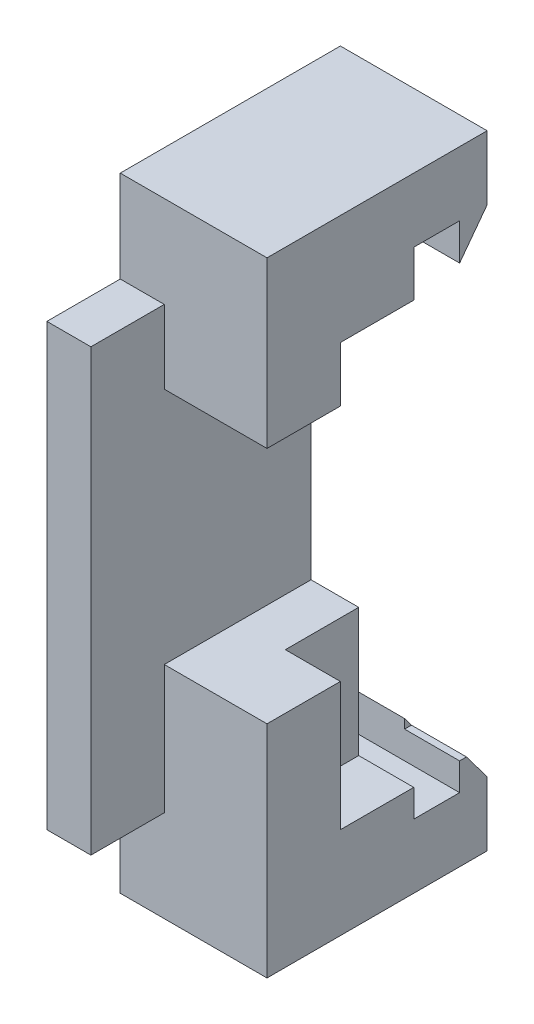
ISO-10303-21;
HEADER;
FILE_DESCRIPTION(('STEP AP214'),'2;1');
FILE_NAME('part.step','',(''),(''),'','','');
FILE_SCHEMA(('AUTOMOTIVE_DESIGN { 1 0 10303 214 1 1 1 1 }'));
ENDSEC;
DATA;
#1=APPLICATION_CONTEXT('core data for automotive mechanical design processes');
#2=APPLICATION_PROTOCOL_DEFINITION('international standard','automotive_design',2000,#1);
#3=PRODUCT_CONTEXT('',#1,'mechanical');
#4=PRODUCT('Part','Part','',(#3));
#5=PRODUCT_RELATED_PRODUCT_CATEGORY('part','',(#4));
#6=PRODUCT_DEFINITION_FORMATION('','',#4);
#7=PRODUCT_DEFINITION_CONTEXT('part definition',#1,'design');
#8=PRODUCT_DEFINITION('design','',#6,#7);
#9=PRODUCT_DEFINITION_SHAPE('','',#8);
#10=(LENGTH_UNIT() NAMED_UNIT(*) SI_UNIT(.MILLI.,.METRE.));
#11=(NAMED_UNIT(*) PLANE_ANGLE_UNIT() SI_UNIT($,.RADIAN.));
#12=(NAMED_UNIT(*) SI_UNIT($,.STERADIAN.) SOLID_ANGLE_UNIT());
#13=UNCERTAINTY_MEASURE_WITH_UNIT(LENGTH_MEASURE(1.E-05),#10,'distance_accuracy_value','');
#14=(GEOMETRIC_REPRESENTATION_CONTEXT(3) GLOBAL_UNCERTAINTY_ASSIGNED_CONTEXT((#13)) GLOBAL_UNIT_ASSIGNED_CONTEXT((#10,
#11,#12)) REPRESENTATION_CONTEXT('',''));
#15=CARTESIAN_POINT('',(0.,0.,0.));
#16=DIRECTION('',(0.,0.,1.));
#17=DIRECTION('',(1.,0.,0.));
#18=AXIS2_PLACEMENT_3D('',#15,#16,#17);
#19=CARTESIAN_POINT('',(4.,0.,6.));
#20=DIRECTION('',(-1.,0.,0.));
#21=DIRECTION('',(0.,0.,1.));
#22=AXIS2_PLACEMENT_3D('',#19,#20,#21);
#23=PLANE('',#22);
#24=DIRECTION('',(0.,1.,0.));
#25=VECTOR('',#24,1.);
#26=CARTESIAN_POINT('',(4.,5.25,4.));
#27=LINE('',#26,#25);
#28=CARTESIAN_POINT('',(4.,2.5,4.));
#29=VERTEX_POINT('',#28);
#30=CARTESIAN_POINT('',(4.,6.,4.));
#31=VERTEX_POINT('',#30);
#32=EDGE_CURVE('E368',#29,#31,#27,.T.);
#33=ORIENTED_EDGE('',*,*,#32,.T.);
#34=DIRECTION('',(0.,0.,1.));
#35=VECTOR('',#34,1.);
#36=CARTESIAN_POINT('',(4.,6.,0.));
#37=LINE('',#36,#35);
#38=CARTESIAN_POINT('',(4.,6.,6.));
#39=VERTEX_POINT('',#38);
#40=EDGE_CURVE('E327',#31,#39,#37,.T.);
#41=ORIENTED_EDGE('',*,*,#40,.T.);
#42=DIRECTION('',(0.,1.,0.));
#43=VECTOR('',#42,1.);
#44=CARTESIAN_POINT('',(4.,0.,6.));
#45=LINE('',#44,#43);
#46=CARTESIAN_POINT('',(4.,0.,6.));
#47=VERTEX_POINT('',#46);
#48=EDGE_CURVE('E270',#47,#39,#45,.T.);
#49=ORIENTED_EDGE('',*,*,#48,.F.);
#50=DIRECTION('',(0.,0.,-1.));
#51=VECTOR('',#50,1.);
#52=CARTESIAN_POINT('',(4.,0.,6.));
#53=LINE('',#52,#51);
#54=CARTESIAN_POINT('',(4.,0.,0.));
#55=VERTEX_POINT('',#54);
#56=EDGE_CURVE('E293',#47,#55,#53,.T.);
#57=ORIENTED_EDGE('',*,*,#56,.T.);
#58=DIRECTION('',(0.,1.,0.));
#59=VECTOR('',#58,1.);
#60=CARTESIAN_POINT('',(4.,0.,0.));
#61=LINE('',#60,#59);
#62=CARTESIAN_POINT('',(4.,1.75,0.));
#63=VERTEX_POINT('',#62);
#64=EDGE_CURVE('E283',#55,#63,#61,.T.);
#65=ORIENTED_EDGE('',*,*,#64,.T.);
#66=DIRECTION('',(0.,0.799999999999999,0.600000000000001));
#67=VECTOR('',#66,1.);
#68=CARTESIAN_POINT('',(4.,1.75,0.));
#69=LINE('',#68,#67);
#70=CARTESIAN_POINT('',(4.,2.5,0.562500000000002));
#71=VERTEX_POINT('',#70);
#72=EDGE_CURVE('E375',#63,#71,#69,.T.);
#73=ORIENTED_EDGE('',*,*,#72,.T.);
#74=DIRECTION('',(0.,0.,1.));
#75=VECTOR('',#74,1.);
#76=CARTESIAN_POINT('',(4.,2.5,0.));
#77=LINE('',#76,#75);
#78=CARTESIAN_POINT('',(4.,2.5,0.750000000000002));
#79=VERTEX_POINT('',#78);
#80=EDGE_CURVE('E259',#71,#79,#77,.T.);
#81=ORIENTED_EDGE('',*,*,#80,.T.);
#82=DIRECTION('',(0.,-1.,0.));
#83=VECTOR('',#82,1.);
#84=CARTESIAN_POINT('',(4.,2.75,0.750000000000002));
#85=LINE('',#84,#83);
#86=CARTESIAN_POINT('',(4.,1.75,0.750000000000002));
#87=VERTEX_POINT('',#86);
#88=EDGE_CURVE('E377',#79,#87,#85,.T.);
#89=ORIENTED_EDGE('',*,*,#88,.T.);
#90=DIRECTION('',(0.,0.,1.));
#91=VECTOR('',#90,1.);
#92=CARTESIAN_POINT('',(4.,1.75,0.750000000000002));
#93=LINE('',#92,#91);
#94=CARTESIAN_POINT('',(4.,1.75,2.));
#95=VERTEX_POINT('',#94);
#96=EDGE_CURVE('E381',#87,#95,#93,.T.);
#97=ORIENTED_EDGE('',*,*,#96,.T.);
#98=DIRECTION('',(0.,1.,0.));
#99=VECTOR('',#98,1.);
#100=CARTESIAN_POINT('',(4.,15.25,2.));
#101=LINE('',#100,#99);
#102=CARTESIAN_POINT('',(4.,2.5,2.));
#103=VERTEX_POINT('',#102);
#104=EDGE_CURVE('E385',#95,#103,#101,.T.);
#105=ORIENTED_EDGE('',*,*,#104,.T.);
#106=EDGE_CURVE('E256',#103,#29,#77,.T.);
#107=ORIENTED_EDGE('',*,*,#106,.T.);
#108=EDGE_LOOP('',(#33,#41,#49,#57,#65,#73,#81,#89,#97,#105,#107));
#109=FACE_BOUND('',#108,.T.);
#110=ADVANCED_FACE('F33',(#109),#23,.F.);
#111=CARTESIAN_POINT('',(0.,0.,6.));
#112=DIRECTION('',(0.,0.,-1.));
#113=DIRECTION('',(-1.,0.,0.));
#114=AXIS2_PLACEMENT_3D('',#111,#112,#113);
#115=PLANE('',#114);
#116=DIRECTION('',(-1.,0.,0.));
#117=VECTOR('',#116,1.);
#118=CARTESIAN_POINT('',(0.,14.5,6.));
#119=LINE('',#118,#117);
#120=CARTESIAN_POINT('',(1.2,14.5,6.));
#121=VERTEX_POINT('',#120);
#122=CARTESIAN_POINT('',(0.,14.5,6.));
#123=VERTEX_POINT('',#122);
#124=EDGE_CURVE('E58',#121,#123,#119,.T.);
#125=ORIENTED_EDGE('',*,*,#124,.F.);
#126=DIRECTION('',(0.,1.,0.));
#127=VECTOR('',#126,1.);
#128=CARTESIAN_POINT('',(1.2,14.5,6.));
#129=LINE('',#128,#127);
#130=CARTESIAN_POINT('',(1.2,12.5,6.));
#131=VERTEX_POINT('',#130);
#132=EDGE_CURVE('E11',#131,#121,#129,.T.);
#133=ORIENTED_EDGE('',*,*,#132,.F.);
#134=DIRECTION('',(-1.,0.,0.));
#135=VECTOR('',#134,1.);
#136=CARTESIAN_POINT('',(4.,12.5,6.));
#137=LINE('',#136,#135);
#138=CARTESIAN_POINT('',(4.,12.5,6.));
#139=VERTEX_POINT('',#138);
#140=EDGE_CURVE('E252',#139,#131,#137,.T.);
#141=ORIENTED_EDGE('',*,*,#140,.F.);
#142=CARTESIAN_POINT('',(4.,17.,6.));
#143=VERTEX_POINT('',#142);
#144=EDGE_CURVE('E244',#139,#143,#45,.T.);
#145=ORIENTED_EDGE('',*,*,#144,.T.);
#146=DIRECTION('',(-1.,0.,0.));
#147=VECTOR('',#146,1.);
#148=CARTESIAN_POINT('',(0.,17.,6.));
#149=LINE('',#148,#147);
#150=CARTESIAN_POINT('',(0.,17.,6.));
#151=VERTEX_POINT('',#150);
#152=EDGE_CURVE('E273',#143,#151,#149,.T.);
#153=ORIENTED_EDGE('',*,*,#152,.T.);
#154=DIRECTION('',(0.,-1.,0.));
#155=VECTOR('',#154,1.);
#156=CARTESIAN_POINT('',(0.,0.,6.));
#157=LINE('',#156,#155);
#158=EDGE_CURVE('E265',#151,#123,#157,.T.);
#159=ORIENTED_EDGE('',*,*,#158,.T.);
#160=EDGE_LOOP('',(#125,#133,#141,#145,#153,#159));
#161=FACE_BOUND('',#160,.T.);
#162=ADVANCED_FACE('F447',(#161),#115,.F.);
#163=CARTESIAN_POINT('',(1.2,2.5,6.));
#164=VERTEX_POINT('',#163);
#165=CARTESIAN_POINT('',(1.2,6.,6.));
#166=VERTEX_POINT('',#165);
#167=EDGE_CURVE('E43',#164,#166,#129,.T.);
#168=ORIENTED_EDGE('',*,*,#167,.F.);
#169=DIRECTION('',(1.,0.,0.));
#170=VECTOR('',#169,1.);
#171=CARTESIAN_POINT('',(0.,2.5,6.));
#172=LINE('',#171,#170);
#173=CARTESIAN_POINT('',(0.,2.5,6.));
#174=VERTEX_POINT('',#173);
#175=EDGE_CURVE('E350',#174,#164,#172,.T.);
#176=ORIENTED_EDGE('',*,*,#175,.F.);
#177=CARTESIAN_POINT('',(0.,0.,6.));
#178=VERTEX_POINT('',#177);
#179=EDGE_CURVE('E268',#174,#178,#157,.T.);
#180=ORIENTED_EDGE('',*,*,#179,.T.);
#181=DIRECTION('',(1.,0.,0.));
#182=VECTOR('',#181,1.);
#183=CARTESIAN_POINT('',(0.,0.,6.));
#184=LINE('',#183,#182);
#185=EDGE_CURVE('E267',#178,#47,#184,.T.);
#186=ORIENTED_EDGE('',*,*,#185,.T.);
#187=ORIENTED_EDGE('',*,*,#48,.T.);
#188=DIRECTION('',(1.,0.,0.));
#189=VECTOR('',#188,1.);
#190=CARTESIAN_POINT('',(4.,6.,6.));
#191=LINE('',#190,#189);
#192=EDGE_CURVE('E246',#166,#39,#191,.T.);
#193=ORIENTED_EDGE('',*,*,#192,.F.);
#194=EDGE_LOOP('',(#168,#176,#180,#186,#187,#193));
#195=FACE_BOUND('',#194,.T.);
#196=ADVANCED_FACE('F342',(#195),#115,.F.);
#197=CARTESIAN_POINT('',(0.,0.,0.));
#198=DIRECTION('',(0.,0.,-1.));
#199=DIRECTION('',(-1.,0.,0.));
#200=AXIS2_PLACEMENT_3D('',#197,#198,#199);
#201=PLANE('',#200);
#202=DIRECTION('',(-1.,0.,0.));
#203=VECTOR('',#202,1.);
#204=CARTESIAN_POINT('',(4.,15.25,0.));
#205=LINE('',#204,#203);
#206=CARTESIAN_POINT('',(4.,15.25,0.));
#207=VERTEX_POINT('',#206);
#208=CARTESIAN_POINT('',(0.,15.25,0.));
#209=VERTEX_POINT('',#208);
#210=EDGE_CURVE('E416',#207,#209,#205,.T.);
#211=ORIENTED_EDGE('',*,*,#210,.T.);
#212=DIRECTION('',(0.,-1.,0.));
#213=VECTOR('',#212,1.);
#214=CARTESIAN_POINT('',(0.,0.,0.));
#215=LINE('',#214,#213);
#216=CARTESIAN_POINT('',(0.,17.,0.));
#217=VERTEX_POINT('',#216);
#218=EDGE_CURVE('E276',#217,#209,#215,.T.);
#219=ORIENTED_EDGE('',*,*,#218,.F.);
#220=DIRECTION('',(-1.,0.,0.));
#221=VECTOR('',#220,1.);
#222=CARTESIAN_POINT('',(0.,17.,0.));
#223=LINE('',#222,#221);
#224=CARTESIAN_POINT('',(4.,17.,0.));
#225=VERTEX_POINT('',#224);
#226=EDGE_CURVE('E286',#225,#217,#223,.T.);
#227=ORIENTED_EDGE('',*,*,#226,.F.);
#228=EDGE_CURVE('E282',#207,#225,#61,.T.);
#229=ORIENTED_EDGE('',*,*,#228,.F.);
#230=EDGE_LOOP('',(#211,#219,#227,#229));
#231=FACE_BOUND('',#230,.T.);
#232=ADVANCED_FACE('F490',(#231),#201,.T.);
#233=CARTESIAN_POINT('',(4.,2.5,0.));
#234=DIRECTION('',(0.,-1.,0.));
#235=DIRECTION('',(0.,0.,-1.));
#236=AXIS2_PLACEMENT_3D('',#233,#234,#235);
#237=PLANE('',#236);
#238=DIRECTION('',(0.,0.,1.));
#239=VECTOR('',#238,1.);
#240=CARTESIAN_POINT('',(2.5,2.5,0.));
#241=LINE('',#240,#239);
#242=CARTESIAN_POINT('',(2.5,2.5,2.));
#243=VERTEX_POINT('',#242);
#244=CARTESIAN_POINT('',(2.5,2.5,4.));
#245=VERTEX_POINT('',#244);
#246=EDGE_CURVE('E261',#243,#245,#241,.T.);
#247=ORIENTED_EDGE('',*,*,#246,.T.);
#248=DIRECTION('',(1.,0.,0.));
#249=VECTOR('',#248,1.);
#250=CARTESIAN_POINT('',(2.,2.5,4.));
#251=LINE('',#250,#249);
#252=EDGE_CURVE('E370',#245,#29,#251,.T.);
#253=ORIENTED_EDGE('',*,*,#252,.T.);
#254=ORIENTED_EDGE('',*,*,#106,.F.);
#255=DIRECTION('',(-1.,0.,0.));
#256=VECTOR('',#255,1.);
#257=CARTESIAN_POINT('',(4.,2.5,2.));
#258=LINE('',#257,#256);
#259=EDGE_CURVE('E318',#103,#243,#258,.T.);
#260=ORIENTED_EDGE('',*,*,#259,.T.);
#261=EDGE_LOOP('',(#247,#253,#254,#260));
#262=FACE_BOUND('',#261,.T.);
#263=ADVANCED_FACE('F539',(#262),#237,.F.);
#264=CARTESIAN_POINT('',(2.5,5.25,0.));
#265=DIRECTION('',(-1.,0.,0.));
#266=DIRECTION('',(0.,0.,1.));
#267=AXIS2_PLACEMENT_3D('',#264,#265,#266);
#268=PLANE('',#267);
#269=DIRECTION('',(0.,1.,0.));
#270=VECTOR('',#269,1.);
#271=CARTESIAN_POINT('',(2.5,5.25,2.));
#272=LINE('',#271,#270);
#273=CARTESIAN_POINT('',(2.5,6.,2.));
#274=VERTEX_POINT('',#273);
#275=EDGE_CURVE('E322',#243,#274,#272,.T.);
#276=ORIENTED_EDGE('',*,*,#275,.T.);
#277=DIRECTION('',(0.,0.,-1.));
#278=VECTOR('',#277,1.);
#279=CARTESIAN_POINT('',(2.5,6.,4.));
#280=LINE('',#279,#278);
#281=CARTESIAN_POINT('',(2.5,6.,4.));
#282=VERTEX_POINT('',#281);
#283=EDGE_CURVE('E438',#282,#274,#280,.T.);
#284=ORIENTED_EDGE('',*,*,#283,.F.);
#285=DIRECTION('',(0.,-1.,0.));
#286=VECTOR('',#285,1.);
#287=CARTESIAN_POINT('',(2.5,5.25,4.));
#288=LINE('',#287,#286);
#289=EDGE_CURVE('E372',#282,#245,#288,.T.);
#290=ORIENTED_EDGE('',*,*,#289,.T.);
#291=ORIENTED_EDGE('',*,*,#246,.F.);
#292=EDGE_LOOP('',(#276,#284,#290,#291));
#293=FACE_BOUND('',#292,.T.);
#294=ADVANCED_FACE('F437',(#293),#268,.F.);
#295=CARTESIAN_POINT('',(0.,0.,6.));
#296=DIRECTION('',(1.,0.,0.));
#297=DIRECTION('',(0.,0.,-1.));
#298=AXIS2_PLACEMENT_3D('',#295,#296,#297);
#299=PLANE('',#298);
#300=ORIENTED_EDGE('',*,*,#218,.T.);
#301=DIRECTION('',(0.,0.799999999999999,-0.600000000000001));
#302=VECTOR('',#301,1.);
#303=CARTESIAN_POINT('',(0.,15.25,0.));
#304=LINE('',#303,#302);
#305=CARTESIAN_POINT('',(0.,14.25,0.750000000000002));
#306=VERTEX_POINT('',#305);
#307=EDGE_CURVE('E378',#306,#209,#304,.T.);
#308=ORIENTED_EDGE('',*,*,#307,.F.);
#309=DIRECTION('',(0.,-1.,0.));
#310=VECTOR('',#309,1.);
#311=CARTESIAN_POINT('',(0.,14.25,0.750000000000002));
#312=LINE('',#311,#310);
#313=CARTESIAN_POINT('',(0.,15.25,0.750000000000002));
#314=VERTEX_POINT('',#313);
#315=EDGE_CURVE('E412',#314,#306,#312,.T.);
#316=ORIENTED_EDGE('',*,*,#315,.F.);
#317=DIRECTION('',(0.,0.,-1.));
#318=VECTOR('',#317,1.);
#319=CARTESIAN_POINT('',(0.,15.25,0.750000000000002));
#320=LINE('',#319,#318);
#321=CARTESIAN_POINT('',(0.,15.25,2.));
#322=VERTEX_POINT('',#321);
#323=EDGE_CURVE('E409',#322,#314,#320,.T.);
#324=ORIENTED_EDGE('',*,*,#323,.F.);
#325=DIRECTION('',(0.,1.,0.));
#326=VECTOR('',#325,1.);
#327=CARTESIAN_POINT('',(0.,15.25,2.));
#328=LINE('',#327,#326);
#329=CARTESIAN_POINT('',(0.,1.75,2.));
#330=VERTEX_POINT('',#329);
#331=EDGE_CURVE('E406',#330,#322,#328,.T.);
#332=ORIENTED_EDGE('',*,*,#331,.F.);
#333=DIRECTION('',(0.,0.,1.));
#334=VECTOR('',#333,1.);
#335=CARTESIAN_POINT('',(0.,1.75,0.750000000000002));
#336=LINE('',#335,#334);
#337=CARTESIAN_POINT('',(0.,1.75,0.750000000000002));
#338=VERTEX_POINT('',#337);
#339=EDGE_CURVE('E403',#338,#330,#336,.T.);
#340=ORIENTED_EDGE('',*,*,#339,.F.);
#341=DIRECTION('',(0.,-1.,0.));
#342=VECTOR('',#341,1.);
#343=CARTESIAN_POINT('',(0.,2.75,0.750000000000002));
#344=LINE('',#343,#342);
#345=CARTESIAN_POINT('',(0.,2.75,0.750000000000002));
#346=VERTEX_POINT('',#345);
#347=EDGE_CURVE('E400',#346,#338,#344,.T.);
#348=ORIENTED_EDGE('',*,*,#347,.F.);
#349=DIRECTION('',(0.,0.799999999999999,0.600000000000001));
#350=VECTOR('',#349,1.);
#351=CARTESIAN_POINT('',(0.,1.75,0.));
#352=LINE('',#351,#350);
#353=CARTESIAN_POINT('',(0.,1.75,0.));
#354=VERTEX_POINT('',#353);
#355=EDGE_CURVE('E374',#354,#346,#352,.T.);
#356=ORIENTED_EDGE('',*,*,#355,.F.);
#357=CARTESIAN_POINT('',(0.,0.,0.));
#358=VERTEX_POINT('',#357);
#359=EDGE_CURVE('E280',#354,#358,#215,.T.);
#360=ORIENTED_EDGE('',*,*,#359,.T.);
#361=DIRECTION('',(0.,0.,-1.));
#362=VECTOR('',#361,1.);
#363=CARTESIAN_POINT('',(0.,0.,6.));
#364=LINE('',#363,#362);
#365=EDGE_CURVE('E296',#178,#358,#364,.T.);
#366=ORIENTED_EDGE('',*,*,#365,.F.);
#367=ORIENTED_EDGE('',*,*,#179,.F.);
#368=DIRECTION('',(0.,0.,-1.));
#369=VECTOR('',#368,1.);
#370=CARTESIAN_POINT('',(0.,2.5,8.));
#371=LINE('',#370,#369);
#372=CARTESIAN_POINT('',(0.,2.5,8.));
#373=VERTEX_POINT('',#372);
#374=EDGE_CURVE('E365',#373,#174,#371,.T.);
#375=ORIENTED_EDGE('',*,*,#374,.F.);
#376=DIRECTION('',(0.,-1.,0.));
#377=VECTOR('',#376,1.);
#378=CARTESIAN_POINT('',(0.,14.5,8.));
#379=LINE('',#378,#377);
#380=CARTESIAN_POINT('',(0.,14.5,8.));
#381=VERTEX_POINT('',#380);
#382=EDGE_CURVE('E351',#381,#373,#379,.T.);
#383=ORIENTED_EDGE('',*,*,#382,.F.);
#384=DIRECTION('',(0.,0.,-1.));
#385=VECTOR('',#384,1.);
#386=CARTESIAN_POINT('',(0.,14.5,8.));
#387=LINE('',#386,#385);
#388=EDGE_CURVE('E357',#381,#123,#387,.T.);
#389=ORIENTED_EDGE('',*,*,#388,.T.);
#390=ORIENTED_EDGE('',*,*,#158,.F.);
#391=DIRECTION('',(0.,0.,-1.));
#392=VECTOR('',#391,1.);
#393=CARTESIAN_POINT('',(0.,17.,6.));
#394=LINE('',#393,#392);
#395=EDGE_CURVE('E275',#151,#217,#394,.T.);
#396=ORIENTED_EDGE('',*,*,#395,.T.);
#397=EDGE_LOOP('',(#300,#308,#316,#324,#332,#340,#348,#356,#360,#366,#367,#375,#383,#389,#390,#396));
#398=FACE_BOUND('',#397,.T.);
#399=ADVANCED_FACE('F35',(#398),#299,.F.);
#400=CARTESIAN_POINT('',(0.,0.,6.));
#401=DIRECTION('',(0.,1.,0.));
#402=DIRECTION('',(0.,0.,1.));
#403=AXIS2_PLACEMENT_3D('',#400,#401,#402);
#404=PLANE('',#403);
#405=DIRECTION('',(1.,0.,0.));
#406=VECTOR('',#405,1.);
#407=CARTESIAN_POINT('',(0.,0.,0.));
#408=LINE('',#407,#406);
#409=EDGE_CURVE('E279',#358,#55,#408,.T.);
#410=ORIENTED_EDGE('',*,*,#409,.T.);
#411=ORIENTED_EDGE('',*,*,#56,.F.);
#412=ORIENTED_EDGE('',*,*,#185,.F.);
#413=ORIENTED_EDGE('',*,*,#365,.T.);
#414=EDGE_LOOP('',(#410,#411,#412,#413));
#415=FACE_BOUND('',#414,.T.);
#416=ADVANCED_FACE('F507',(#415),#404,.F.);
#417=DIRECTION('',(0.,-1.,0.));
#418=VECTOR('',#417,1.);
#419=CARTESIAN_POINT('',(4.,12.5,4.));
#420=LINE('',#419,#418);
#421=CARTESIAN_POINT('',(4.,14.,4.));
#422=VERTEX_POINT('',#421);
#423=CARTESIAN_POINT('',(4.,12.5,4.));
#424=VERTEX_POINT('',#423);
#425=EDGE_CURVE('E221',#422,#424,#420,.T.);
#426=ORIENTED_EDGE('',*,*,#425,.F.);
#427=DIRECTION('',(0.,0.,-1.));
#428=VECTOR('',#427,1.);
#429=CARTESIAN_POINT('',(4.,14.,4.));
#430=LINE('',#429,#428);
#431=CARTESIAN_POINT('',(4.,14.,2.));
#432=VERTEX_POINT('',#431);
#433=EDGE_CURVE('E353',#422,#432,#430,.T.);
#434=ORIENTED_EDGE('',*,*,#433,.T.);
#435=CARTESIAN_POINT('',(4.,15.25,2.));
#436=VERTEX_POINT('',#435);
#437=EDGE_CURVE('E384',#432,#436,#101,.T.);
#438=ORIENTED_EDGE('',*,*,#437,.T.);
#439=DIRECTION('',(0.,0.,-1.));
#440=VECTOR('',#439,1.);
#441=CARTESIAN_POINT('',(4.,15.25,0.750000000000002));
#442=LINE('',#441,#440);
#443=CARTESIAN_POINT('',(4.,15.25,0.750000000000002));
#444=VERTEX_POINT('',#443);
#445=EDGE_CURVE('E388',#436,#444,#442,.T.);
#446=ORIENTED_EDGE('',*,*,#445,.T.);
#447=DIRECTION('',(0.,-1.,0.));
#448=VECTOR('',#447,1.);
#449=CARTESIAN_POINT('',(4.,14.25,0.750000000000002));
#450=LINE('',#449,#448);
#451=CARTESIAN_POINT('',(4.,14.25,0.750000000000002));
#452=VERTEX_POINT('',#451);
#453=EDGE_CURVE('E391',#444,#452,#450,.T.);
#454=ORIENTED_EDGE('',*,*,#453,.T.);
#455=DIRECTION('',(0.,0.799999999999999,-0.600000000000001));
#456=VECTOR('',#455,1.);
#457=CARTESIAN_POINT('',(4.,15.25,0.));
#458=LINE('',#457,#456);
#459=EDGE_CURVE('E394',#452,#207,#458,.T.);
#460=ORIENTED_EDGE('',*,*,#459,.T.);
#461=ORIENTED_EDGE('',*,*,#228,.T.);
#462=DIRECTION('',(0.,0.,-1.));
#463=VECTOR('',#462,1.);
#464=CARTESIAN_POINT('',(4.,17.,6.));
#465=LINE('',#464,#463);
#466=EDGE_CURVE('E290',#143,#225,#465,.T.);
#467=ORIENTED_EDGE('',*,*,#466,.F.);
#468=ORIENTED_EDGE('',*,*,#144,.F.);
#469=DIRECTION('',(0.,0.,1.));
#470=VECTOR('',#469,1.);
#471=CARTESIAN_POINT('',(4.,12.5,0.));
#472=LINE('',#471,#470);
#473=EDGE_CURVE('E237',#424,#139,#472,.T.);
#474=ORIENTED_EDGE('',*,*,#473,.F.);
#475=EDGE_LOOP('',(#426,#434,#438,#446,#454,#460,#461,#467,#468,#474));
#476=FACE_BOUND('',#475,.T.);
#477=ADVANCED_FACE('F242',(#476),#23,.F.);
#478=CARTESIAN_POINT('',(0.,17.,6.));
#479=DIRECTION('',(0.,-1.,0.));
#480=DIRECTION('',(0.,0.,-1.));
#481=AXIS2_PLACEMENT_3D('',#478,#479,#480);
#482=PLANE('',#481);
#483=ORIENTED_EDGE('',*,*,#226,.T.);
#484=ORIENTED_EDGE('',*,*,#395,.F.);
#485=ORIENTED_EDGE('',*,*,#152,.F.);
#486=ORIENTED_EDGE('',*,*,#466,.T.);
#487=EDGE_LOOP('',(#483,#484,#485,#486));
#488=FACE_BOUND('',#487,.T.);
#489=ADVANCED_FACE('F497',(#488),#482,.F.);
#490=DIRECTION('',(-1.,0.,0.));
#491=VECTOR('',#490,1.);
#492=CARTESIAN_POINT('',(4.,1.75,0.));
#493=LINE('',#492,#491);
#494=EDGE_CURVE('E397',#63,#354,#493,.T.);
#495=ORIENTED_EDGE('',*,*,#494,.F.);
#496=ORIENTED_EDGE('',*,*,#64,.F.);
#497=ORIENTED_EDGE('',*,*,#409,.F.);
#498=ORIENTED_EDGE('',*,*,#359,.F.);
#499=EDGE_LOOP('',(#495,#496,#497,#498));
#500=FACE_BOUND('',#499,.T.);
#501=ADVANCED_FACE('F499',(#500),#201,.T.);
#502=CARTESIAN_POINT('',(2.5,2.5,0.562500000000002));
#503=VERTEX_POINT('',#502);
#504=CARTESIAN_POINT('',(2.5,2.5,0.750000000000002));
#505=VERTEX_POINT('',#504);
#506=EDGE_CURVE('E260',#503,#505,#241,.T.);
#507=ORIENTED_EDGE('',*,*,#506,.T.);
#508=DIRECTION('',(1.,0.,0.));
#509=VECTOR('',#508,1.);
#510=CARTESIAN_POINT('',(4.,2.5,0.750000000000002));
#511=LINE('',#510,#509);
#512=EDGE_CURVE('E264',#505,#79,#511,.T.);
#513=ORIENTED_EDGE('',*,*,#512,.T.);
#514=ORIENTED_EDGE('',*,*,#80,.F.);
#515=DIRECTION('',(-1.,0.,0.));
#516=VECTOR('',#515,1.);
#517=CARTESIAN_POINT('',(4.,2.5,0.562500000000002));
#518=LINE('',#517,#516);
#519=EDGE_CURVE('E315',#71,#503,#518,.T.);
#520=ORIENTED_EDGE('',*,*,#519,.T.);
#521=EDGE_LOOP('',(#507,#513,#514,#520));
#522=FACE_BOUND('',#521,.T.);
#523=ADVANCED_FACE('F312',(#522),#237,.F.);
#524=DIRECTION('',(0.,0.799999999999999,0.600000000000001));
#525=VECTOR('',#524,1.);
#526=CARTESIAN_POINT('',(2.5,3.98999999999999,1.68));
#527=LINE('',#526,#525);
#528=CARTESIAN_POINT('',(2.5,2.75,0.750000000000002));
#529=VERTEX_POINT('',#528);
#530=EDGE_CURVE('E300',#503,#529,#527,.T.);
#531=ORIENTED_EDGE('',*,*,#530,.T.);
#532=DIRECTION('',(0.,-1.,0.));
#533=VECTOR('',#532,1.);
#534=CARTESIAN_POINT('',(2.5,5.25,0.750000000000002));
#535=LINE('',#534,#533);
#536=EDGE_CURVE('E37',#529,#505,#535,.T.);
#537=ORIENTED_EDGE('',*,*,#536,.T.);
#538=ORIENTED_EDGE('',*,*,#506,.F.);
#539=EDGE_LOOP('',(#531,#537,#538));
#540=FACE_BOUND('',#539,.T.);
#541=ADVANCED_FACE('F306',(#540),#268,.F.);
#542=CARTESIAN_POINT('',(4.,6.,0.));
#543=DIRECTION('',(0.,-1.,0.));
#544=DIRECTION('',(1.,0.,0.));
#545=AXIS2_PLACEMENT_3D('',#542,#543,#544);
#546=PLANE('',#545);
#547=DIRECTION('',(1.,0.,0.));
#548=VECTOR('',#547,1.);
#549=CARTESIAN_POINT('',(2.5,6.,4.));
#550=LINE('',#549,#548);
#551=EDGE_CURVE('E441',#282,#31,#550,.T.);
#552=ORIENTED_EDGE('',*,*,#551,.F.);
#553=ORIENTED_EDGE('',*,*,#283,.T.);
#554=DIRECTION('',(-1.,0.,0.));
#555=VECTOR('',#554,1.);
#556=CARTESIAN_POINT('',(4.,6.,2.));
#557=LINE('',#556,#555);
#558=CARTESIAN_POINT('',(1.2,6.,2.));
#559=VERTEX_POINT('',#558);
#560=EDGE_CURVE('E336',#274,#559,#557,.T.);
#561=ORIENTED_EDGE('',*,*,#560,.T.);
#562=DIRECTION('',(0.,0.,1.));
#563=VECTOR('',#562,1.);
#564=CARTESIAN_POINT('',(1.2,6.,0.));
#565=LINE('',#564,#563);
#566=EDGE_CURVE('E249',#559,#166,#565,.T.);
#567=ORIENTED_EDGE('',*,*,#566,.T.);
#568=ORIENTED_EDGE('',*,*,#192,.T.);
#569=ORIENTED_EDGE('',*,*,#40,.F.);
#570=EDGE_LOOP('',(#552,#553,#561,#567,#568,#569));
#571=FACE_BOUND('',#570,.T.);
#572=ADVANCED_FACE('F332',(#571),#546,.F.);
#573=CARTESIAN_POINT('',(1.2,12.5,0.));
#574=DIRECTION('',(-1.,0.,0.));
#575=DIRECTION('',(0.,-1.,0.));
#576=AXIS2_PLACEMENT_3D('',#573,#574,#575);
#577=PLANE('',#576);
#578=ORIENTED_EDGE('',*,*,#566,.F.);
#579=DIRECTION('',(0.,1.,0.));
#580=VECTOR('',#579,1.);
#581=CARTESIAN_POINT('',(1.2,12.5,2.));
#582=LINE('',#581,#580);
#583=CARTESIAN_POINT('',(1.2,12.5,2.));
#584=VERTEX_POINT('',#583);
#585=EDGE_CURVE('E419',#559,#584,#582,.T.);
#586=ORIENTED_EDGE('',*,*,#585,.T.);
#587=DIRECTION('',(0.,0.,1.));
#588=VECTOR('',#587,1.);
#589=CARTESIAN_POINT('',(1.2,12.5,0.));
#590=LINE('',#589,#588);
#591=EDGE_CURVE('E245',#584,#131,#590,.T.);
#592=ORIENTED_EDGE('',*,*,#591,.T.);
#593=ORIENTED_EDGE('',*,*,#132,.T.);
#594=DIRECTION('',(0.,0.,-1.));
#595=VECTOR('',#594,1.);
#596=CARTESIAN_POINT('',(1.2,14.5,8.));
#597=LINE('',#596,#595);
#598=CARTESIAN_POINT('',(1.2,14.5,8.));
#599=VERTEX_POINT('',#598);
#600=EDGE_CURVE('E360',#599,#121,#597,.T.);
#601=ORIENTED_EDGE('',*,*,#600,.F.);
#602=DIRECTION('',(0.,1.,0.));
#603=VECTOR('',#602,1.);
#604=CARTESIAN_POINT('',(1.2,14.5,8.));
#605=LINE('',#604,#603);
#606=CARTESIAN_POINT('',(1.2,2.5,8.));
#607=VERTEX_POINT('',#606);
#608=EDGE_CURVE('E456',#607,#599,#605,.T.);
#609=ORIENTED_EDGE('',*,*,#608,.F.);
#610=DIRECTION('',(0.,0.,-1.));
#611=VECTOR('',#610,1.);
#612=CARTESIAN_POINT('',(1.2,2.5,8.));
#613=LINE('',#612,#611);
#614=EDGE_CURVE('E349',#607,#164,#613,.T.);
#615=ORIENTED_EDGE('',*,*,#614,.T.);
#616=ORIENTED_EDGE('',*,*,#167,.T.);
#617=EDGE_LOOP('',(#578,#586,#592,#593,#601,#609,#615,#616));
#618=FACE_BOUND('',#617,.T.);
#619=ADVANCED_FACE('F346',(#618),#577,.F.);
#620=CARTESIAN_POINT('',(4.,12.5,0.));
#621=DIRECTION('',(0.,1.,0.));
#622=DIRECTION('',(-1.,0.,0.));
#623=AXIS2_PLACEMENT_3D('',#620,#621,#622);
#624=PLANE('',#623);
#625=DIRECTION('',(1.,0.,0.));
#626=VECTOR('',#625,1.);
#627=CARTESIAN_POINT('',(4.,12.5,2.));
#628=LINE('',#627,#626);
#629=CARTESIAN_POINT('',(2.5,12.5,2.));
#630=VERTEX_POINT('',#629);
#631=EDGE_CURVE('E299',#584,#630,#628,.T.);
#632=ORIENTED_EDGE('',*,*,#631,.T.);
#633=DIRECTION('',(0.,0.,-1.));
#634=VECTOR('',#633,1.);
#635=CARTESIAN_POINT('',(2.5,12.5,4.));
#636=LINE('',#635,#634);
#637=CARTESIAN_POINT('',(2.5,12.5,4.));
#638=VERTEX_POINT('',#637);
#639=EDGE_CURVE('E50',#638,#630,#636,.T.);
#640=ORIENTED_EDGE('',*,*,#639,.F.);
#641=DIRECTION('',(-1.,0.,0.));
#642=VECTOR('',#641,1.);
#643=CARTESIAN_POINT('',(4.,12.5,4.));
#644=LINE('',#643,#642);
#645=EDGE_CURVE('E225',#424,#638,#644,.T.);
#646=ORIENTED_EDGE('',*,*,#645,.F.);
#647=ORIENTED_EDGE('',*,*,#473,.T.);
#648=ORIENTED_EDGE('',*,*,#140,.T.);
#649=ORIENTED_EDGE('',*,*,#591,.F.);
#650=EDGE_LOOP('',(#632,#640,#646,#647,#648,#649));
#651=FACE_BOUND('',#650,.T.);
#652=ADVANCED_FACE('F235',(#651),#624,.F.);
#653=CARTESIAN_POINT('',(4.,2.75,0.750000000000002));
#654=DIRECTION('',(0.,0.,-1.));
#655=DIRECTION('',(-1.,0.,0.));
#656=AXIS2_PLACEMENT_3D('',#653,#654,#655);
#657=PLANE('',#656);
#658=ORIENTED_EDGE('',*,*,#536,.F.);
#659=DIRECTION('',(-1.,0.,0.));
#660=VECTOR('',#659,1.);
#661=CARTESIAN_POINT('',(4.,2.75,0.750000000000002));
#662=LINE('',#661,#660);
#663=EDGE_CURVE('E430',#529,#346,#662,.T.);
#664=ORIENTED_EDGE('',*,*,#663,.T.);
#665=ORIENTED_EDGE('',*,*,#347,.T.);
#666=DIRECTION('',(-1.,0.,0.));
#667=VECTOR('',#666,1.);
#668=CARTESIAN_POINT('',(4.,1.75,0.750000000000002));
#669=LINE('',#668,#667);
#670=EDGE_CURVE('E428',#87,#338,#669,.T.);
#671=ORIENTED_EDGE('',*,*,#670,.F.);
#672=ORIENTED_EDGE('',*,*,#88,.F.);
#673=ORIENTED_EDGE('',*,*,#512,.F.);
#674=EDGE_LOOP('',(#658,#664,#665,#671,#672,#673));
#675=FACE_BOUND('',#674,.T.);
#676=ADVANCED_FACE('F531',(#675),#657,.F.);
#677=CARTESIAN_POINT('',(4.,1.75,0.));
#678=DIRECTION('',(0.,-0.600000000000001,0.799999999999999));
#679=DIRECTION('',(0.,-0.799999999999999,-0.600000000000001));
#680=AXIS2_PLACEMENT_3D('',#677,#678,#679);
#681=PLANE('',#680);
#682=ORIENTED_EDGE('',*,*,#72,.F.);
#683=ORIENTED_EDGE('',*,*,#494,.T.);
#684=ORIENTED_EDGE('',*,*,#355,.T.);
#685=ORIENTED_EDGE('',*,*,#663,.F.);
#686=ORIENTED_EDGE('',*,*,#530,.F.);
#687=ORIENTED_EDGE('',*,*,#519,.F.);
#688=EDGE_LOOP('',(#682,#683,#684,#685,#686,#687));
#689=FACE_BOUND('',#688,.T.);
#690=ADVANCED_FACE('F528',(#689),#681,.F.);
#691=CARTESIAN_POINT('',(4.,15.25,2.));
#692=DIRECTION('',(0.,0.,1.));
#693=DIRECTION('',(1.,0.,0.));
#694=AXIS2_PLACEMENT_3D('',#691,#692,#693);
#695=PLANE('',#694);
#696=ORIENTED_EDGE('',*,*,#437,.F.);
#697=DIRECTION('',(1.,0.,0.));
#698=VECTOR('',#697,1.);
#699=CARTESIAN_POINT('',(4.,14.,2.));
#700=LINE('',#699,#698);
#701=CARTESIAN_POINT('',(2.5,14.,2.));
#702=VERTEX_POINT('',#701);
#703=EDGE_CURVE('E231',#702,#432,#700,.T.);
#704=ORIENTED_EDGE('',*,*,#703,.F.);
#705=DIRECTION('',(0.,1.,0.));
#706=VECTOR('',#705,1.);
#707=CARTESIAN_POINT('',(2.5,12.5,2.));
#708=LINE('',#707,#706);
#709=EDGE_CURVE('E442',#630,#702,#708,.T.);
#710=ORIENTED_EDGE('',*,*,#709,.F.);
#711=ORIENTED_EDGE('',*,*,#631,.F.);
#712=ORIENTED_EDGE('',*,*,#585,.F.);
#713=ORIENTED_EDGE('',*,*,#560,.F.);
#714=ORIENTED_EDGE('',*,*,#275,.F.);
#715=ORIENTED_EDGE('',*,*,#259,.F.);
#716=ORIENTED_EDGE('',*,*,#104,.F.);
#717=DIRECTION('',(-1.,0.,0.));
#718=VECTOR('',#717,1.);
#719=CARTESIAN_POINT('',(4.,1.75,2.));
#720=LINE('',#719,#718);
#721=EDGE_CURVE('E426',#95,#330,#720,.T.);
#722=ORIENTED_EDGE('',*,*,#721,.T.);
#723=ORIENTED_EDGE('',*,*,#331,.T.);
#724=DIRECTION('',(-1.,0.,0.));
#725=VECTOR('',#724,1.);
#726=CARTESIAN_POINT('',(4.,15.25,2.));
#727=LINE('',#726,#725);
#728=EDGE_CURVE('E424',#436,#322,#727,.T.);
#729=ORIENTED_EDGE('',*,*,#728,.F.);
#730=EDGE_LOOP('',(#696,#704,#710,#711,#712,#713,#714,#715,#716,#722,#723,#729));
#731=FACE_BOUND('',#730,.T.);
#732=ADVANCED_FACE('F445',(#731),#695,.F.);
#733=CARTESIAN_POINT('',(4.,15.25,0.));
#734=DIRECTION('',(0.,0.600000000000001,0.799999999999999));
#735=DIRECTION('',(0.,-0.799999999999999,0.600000000000001));
#736=AXIS2_PLACEMENT_3D('',#733,#734,#735);
#737=PLANE('',#736);
#738=ORIENTED_EDGE('',*,*,#307,.T.);
#739=ORIENTED_EDGE('',*,*,#210,.F.);
#740=ORIENTED_EDGE('',*,*,#459,.F.);
#741=DIRECTION('',(-1.,0.,0.));
#742=VECTOR('',#741,1.);
#743=CARTESIAN_POINT('',(4.,14.25,0.750000000000002));
#744=LINE('',#743,#742);
#745=EDGE_CURVE('E420',#452,#306,#744,.T.);
#746=ORIENTED_EDGE('',*,*,#745,.T.);
#747=EDGE_LOOP('',(#738,#739,#740,#746));
#748=FACE_BOUND('',#747,.T.);
#749=ADVANCED_FACE('F487',(#748),#737,.F.);
#750=CARTESIAN_POINT('',(4.,14.25,0.750000000000002));
#751=DIRECTION('',(0.,0.,-1.));
#752=DIRECTION('',(-1.,0.,0.));
#753=AXIS2_PLACEMENT_3D('',#750,#751,#752);
#754=PLANE('',#753);
#755=ORIENTED_EDGE('',*,*,#315,.T.);
#756=ORIENTED_EDGE('',*,*,#745,.F.);
#757=ORIENTED_EDGE('',*,*,#453,.F.);
#758=DIRECTION('',(-1.,0.,0.));
#759=VECTOR('',#758,1.);
#760=CARTESIAN_POINT('',(4.,15.25,0.750000000000002));
#761=LINE('',#760,#759);
#762=EDGE_CURVE('E422',#444,#314,#761,.T.);
#763=ORIENTED_EDGE('',*,*,#762,.T.);
#764=EDGE_LOOP('',(#755,#756,#757,#763));
#765=FACE_BOUND('',#764,.T.);
#766=ADVANCED_FACE('F483',(#765),#754,.F.);
#767=CARTESIAN_POINT('',(4.,15.25,0.750000000000002));
#768=DIRECTION('',(0.,1.,0.));
#769=DIRECTION('',(0.,0.,1.));
#770=AXIS2_PLACEMENT_3D('',#767,#768,#769);
#771=PLANE('',#770);
#772=ORIENTED_EDGE('',*,*,#323,.T.);
#773=ORIENTED_EDGE('',*,*,#762,.F.);
#774=ORIENTED_EDGE('',*,*,#445,.F.);
#775=ORIENTED_EDGE('',*,*,#728,.T.);
#776=EDGE_LOOP('',(#772,#773,#774,#775));
#777=FACE_BOUND('',#776,.T.);
#778=ADVANCED_FACE('F478',(#777),#771,.F.);
#779=CARTESIAN_POINT('',(4.,1.75,0.750000000000002));
#780=DIRECTION('',(0.,-1.,0.));
#781=DIRECTION('',(0.,0.,-1.));
#782=AXIS2_PLACEMENT_3D('',#779,#780,#781);
#783=PLANE('',#782);
#784=ORIENTED_EDGE('',*,*,#339,.T.);
#785=ORIENTED_EDGE('',*,*,#721,.F.);
#786=ORIENTED_EDGE('',*,*,#96,.F.);
#787=ORIENTED_EDGE('',*,*,#670,.T.);
#788=EDGE_LOOP('',(#784,#785,#786,#787));
#789=FACE_BOUND('',#788,.T.);
#790=ADVANCED_FACE('F534',(#789),#783,.F.);
#791=CARTESIAN_POINT('',(2.,5.25,4.));
#792=DIRECTION('',(0.,0.,-1.));
#793=DIRECTION('',(-1.,0.,0.));
#794=AXIS2_PLACEMENT_3D('',#791,#792,#793);
#795=PLANE('',#794);
#796=ORIENTED_EDGE('',*,*,#289,.F.);
#797=ORIENTED_EDGE('',*,*,#551,.T.);
#798=ORIENTED_EDGE('',*,*,#32,.F.);
#799=ORIENTED_EDGE('',*,*,#252,.F.);
#800=EDGE_LOOP('',(#796,#797,#798,#799));
#801=FACE_BOUND('',#800,.T.);
#802=ADVANCED_FACE('F542',(#801),#795,.T.);
#803=CARTESIAN_POINT('',(0.,2.5,8.));
#804=DIRECTION('',(0.,1.,0.));
#805=DIRECTION('',(-1.,0.,0.));
#806=AXIS2_PLACEMENT_3D('',#803,#804,#805);
#807=PLANE('',#806);
#808=ORIENTED_EDGE('',*,*,#175,.T.);
#809=ORIENTED_EDGE('',*,*,#614,.F.);
#810=DIRECTION('',(1.,0.,0.));
#811=VECTOR('',#810,1.);
#812=CARTESIAN_POINT('',(0.,2.5,8.));
#813=LINE('',#812,#811);
#814=EDGE_CURVE('E457',#373,#607,#813,.T.);
#815=ORIENTED_EDGE('',*,*,#814,.F.);
#816=ORIENTED_EDGE('',*,*,#374,.T.);
#817=EDGE_LOOP('',(#808,#809,#815,#816));
#818=FACE_BOUND('',#817,.T.);
#819=ADVANCED_FACE('F544',(#818),#807,.F.);
#820=CARTESIAN_POINT('',(0.,14.5,8.));
#821=DIRECTION('',(0.,-1.,0.));
#822=DIRECTION('',(0.,0.,-1.));
#823=AXIS2_PLACEMENT_3D('',#820,#821,#822);
#824=PLANE('',#823);
#825=ORIENTED_EDGE('',*,*,#124,.T.);
#826=ORIENTED_EDGE('',*,*,#388,.F.);
#827=DIRECTION('',(-1.,0.,0.));
#828=VECTOR('',#827,1.);
#829=CARTESIAN_POINT('',(0.,14.5,8.));
#830=LINE('',#829,#828);
#831=EDGE_CURVE('E361',#599,#381,#830,.T.);
#832=ORIENTED_EDGE('',*,*,#831,.F.);
#833=ORIENTED_EDGE('',*,*,#600,.T.);
#834=EDGE_LOOP('',(#825,#826,#832,#833));
#835=FACE_BOUND('',#834,.T.);
#836=ADVANCED_FACE('F451',(#835),#824,.F.);
#837=CARTESIAN_POINT('',(0.,0.,8.));
#838=DIRECTION('',(0.,0.,1.));
#839=DIRECTION('',(1.,0.,0.));
#840=AXIS2_PLACEMENT_3D('',#837,#838,#839);
#841=PLANE('',#840);
#842=ORIENTED_EDGE('',*,*,#382,.T.);
#843=ORIENTED_EDGE('',*,*,#814,.T.);
#844=ORIENTED_EDGE('',*,*,#608,.T.);
#845=ORIENTED_EDGE('',*,*,#831,.T.);
#846=EDGE_LOOP('',(#842,#843,#844,#845));
#847=FACE_BOUND('',#846,.T.);
#848=ADVANCED_FACE('F711',(#847),#841,.T.);
#849=CARTESIAN_POINT('',(4.,14.,4.));
#850=DIRECTION('',(0.,1.,0.));
#851=DIRECTION('',(0.,0.,1.));
#852=AXIS2_PLACEMENT_3D('',#849,#850,#851);
#853=PLANE('',#852);
#854=ORIENTED_EDGE('',*,*,#703,.T.);
#855=ORIENTED_EDGE('',*,*,#433,.F.);
#856=DIRECTION('',(1.,0.,0.));
#857=VECTOR('',#856,1.);
#858=CARTESIAN_POINT('',(4.,14.,4.));
#859=LINE('',#858,#857);
#860=CARTESIAN_POINT('',(2.5,14.,4.));
#861=VERTEX_POINT('',#860);
#862=EDGE_CURVE('E227',#861,#422,#859,.T.);
#863=ORIENTED_EDGE('',*,*,#862,.F.);
#864=DIRECTION('',(0.,0.,-1.));
#865=VECTOR('',#864,1.);
#866=CARTESIAN_POINT('',(2.5,14.,4.));
#867=LINE('',#866,#865);
#868=EDGE_CURVE('E464',#861,#702,#867,.T.);
#869=ORIENTED_EDGE('',*,*,#868,.T.);
#870=EDGE_LOOP('',(#854,#855,#863,#869));
#871=FACE_BOUND('',#870,.T.);
#872=ADVANCED_FACE('F471',(#871),#853,.F.);
#873=CARTESIAN_POINT('',(2.5,12.5,4.));
#874=DIRECTION('',(-1.,0.,0.));
#875=DIRECTION('',(0.,0.,1.));
#876=AXIS2_PLACEMENT_3D('',#873,#874,#875);
#877=PLANE('',#876);
#878=ORIENTED_EDGE('',*,*,#709,.T.);
#879=ORIENTED_EDGE('',*,*,#868,.F.);
#880=DIRECTION('',(0.,1.,0.));
#881=VECTOR('',#880,1.);
#882=CARTESIAN_POINT('',(2.5,12.5,4.));
#883=LINE('',#882,#881);
#884=EDGE_CURVE('E239',#638,#861,#883,.T.);
#885=ORIENTED_EDGE('',*,*,#884,.F.);
#886=ORIENTED_EDGE('',*,*,#639,.T.);
#887=EDGE_LOOP('',(#878,#879,#885,#886));
#888=FACE_BOUND('',#887,.T.);
#889=ADVANCED_FACE('F710',(#888),#877,.F.);
#890=CARTESIAN_POINT('',(0.,0.,4.));
#891=DIRECTION('',(0.,0.,1.));
#892=DIRECTION('',(1.,0.,0.));
#893=AXIS2_PLACEMENT_3D('',#890,#891,#892);
#894=PLANE('',#893);
#895=ORIENTED_EDGE('',*,*,#425,.T.);
#896=ORIENTED_EDGE('',*,*,#645,.T.);
#897=ORIENTED_EDGE('',*,*,#884,.T.);
#898=ORIENTED_EDGE('',*,*,#862,.T.);
#899=EDGE_LOOP('',(#895,#896,#897,#898));
#900=FACE_BOUND('',#899,.T.);
#901=ADVANCED_FACE('F223',(#900),#894,.F.);
#902=CLOSED_SHELL('',(#110,#162,#196,#232,#263,#294,#399,#416,#477,#489,#501,#523,#541,#572,
#619,#652,#676,#690,#732,#749,#766,#778,#790,#802,#819,#836,#848,#872,#889,#901));
#903=MANIFOLD_SOLID_BREP('B2',#902);
#904=ADVANCED_BREP_SHAPE_REPRESENTATION('',(#18,#903),#14);
#905=SHAPE_DEFINITION_REPRESENTATION(#9,#904);
ENDSEC;
END-ISO-10303-21;
